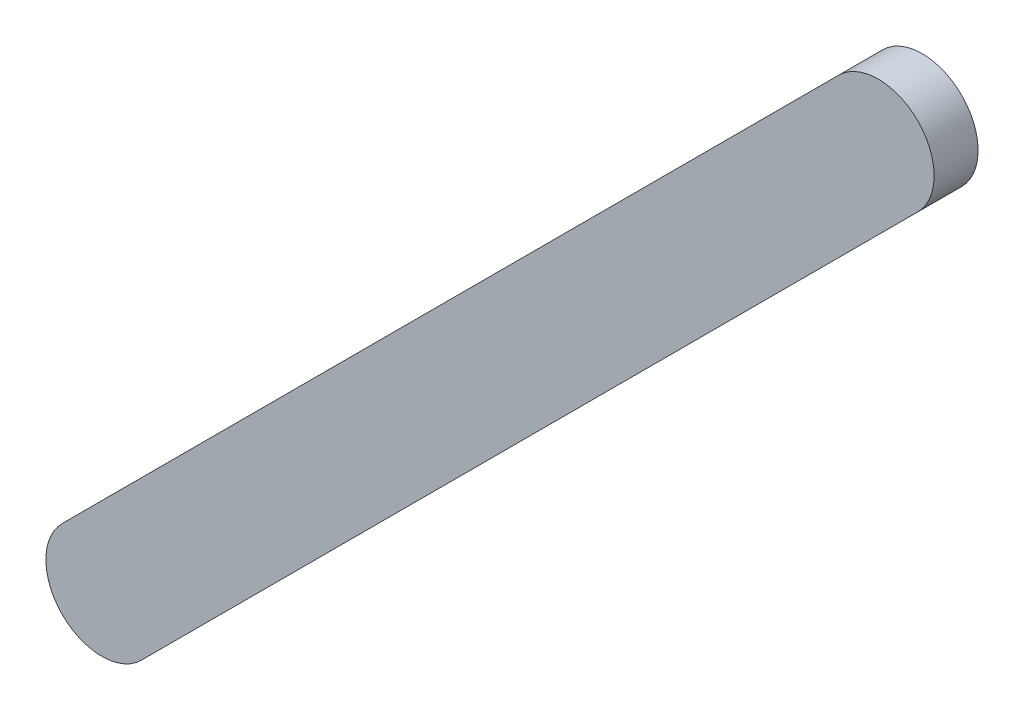
ISO-10303-21;
HEADER;
FILE_DESCRIPTION(('STEP AP214'),'2;1');
FILE_NAME('part.step','',(''),(''),'','','');
FILE_SCHEMA(('AUTOMOTIVE_DESIGN { 1 0 10303 214 1 1 1 1 }'));
ENDSEC;
DATA;
#1=APPLICATION_CONTEXT('core data for automotive mechanical design processes');
#2=APPLICATION_PROTOCOL_DEFINITION('international standard','automotive_design',2000,#1);
#3=PRODUCT_CONTEXT('',#1,'mechanical');
#4=PRODUCT('Part','Part','',(#3));
#5=PRODUCT_RELATED_PRODUCT_CATEGORY('part','',(#4));
#6=PRODUCT_DEFINITION_FORMATION('','',#4);
#7=PRODUCT_DEFINITION_CONTEXT('part definition',#1,'design');
#8=PRODUCT_DEFINITION('design','',#6,#7);
#9=PRODUCT_DEFINITION_SHAPE('','',#8);
#10=(LENGTH_UNIT() NAMED_UNIT(*) SI_UNIT(.MILLI.,.METRE.));
#11=(NAMED_UNIT(*) PLANE_ANGLE_UNIT() SI_UNIT($,.RADIAN.));
#12=(NAMED_UNIT(*) SI_UNIT($,.STERADIAN.) SOLID_ANGLE_UNIT());
#13=UNCERTAINTY_MEASURE_WITH_UNIT(LENGTH_MEASURE(1.E-05),#10,'distance_accuracy_value','');
#14=(GEOMETRIC_REPRESENTATION_CONTEXT(3) GLOBAL_UNCERTAINTY_ASSIGNED_CONTEXT((#13)) GLOBAL_UNIT_ASSIGNED_CONTEXT((#10,
#11,#12)) REPRESENTATION_CONTEXT('',''));
#15=CARTESIAN_POINT('',(0.,0.,0.));
#16=DIRECTION('',(0.,0.,1.));
#17=DIRECTION('',(1.,0.,0.));
#18=AXIS2_PLACEMENT_3D('',#15,#16,#17);
#19=CARTESIAN_POINT('',(113.71760594,52.2713966,0.));
#20=DIRECTION('',(-0.707106781186547,0.707106781186548,0.));
#21=DIRECTION('',(0.707106781186548,0.707106781186547,0.));
#22=AXIS2_PLACEMENT_3D('',#19,#20,#21);
#23=PLANE('',#22);
#24=DIRECTION('',(0.707106781186548,0.707106781186547,0.));
#25=VECTOR('',#24,1.);
#26=CARTESIAN_POINT('',(113.71760594,52.2713966,0.1999996));
#27=LINE('',#26,#25);
#28=CARTESIAN_POINT('',(113.71760594,52.2713966,0.1999996));
#29=VERTEX_POINT('',#28);
#30=CARTESIAN_POINT('',(117.2482034,55.80199406,0.1999996));
#31=VERTEX_POINT('',#30);
#32=EDGE_CURVE('E11',#29,#31,#27,.T.);
#33=ORIENTED_EDGE('',*,*,#32,.F.);
#34=DIRECTION('',(0.,0.,1.));
#35=VECTOR('',#34,1.);
#36=CARTESIAN_POINT('',(113.71760594,52.2713966,0.));
#37=LINE('',#36,#35);
#38=CARTESIAN_POINT('',(113.71760594,52.2713966,0.));
#39=VERTEX_POINT('',#38);
#40=EDGE_CURVE('E24',#39,#29,#37,.T.);
#41=ORIENTED_EDGE('',*,*,#40,.F.);
#42=DIRECTION('',(0.707106781186548,0.707106781186547,0.));
#43=VECTOR('',#42,1.);
#44=CARTESIAN_POINT('',(113.71760594,52.2713966,0.));
#45=LINE('',#44,#43);
#46=CARTESIAN_POINT('',(117.2482034,55.80199406,0.));
#47=VERTEX_POINT('',#46);
#48=EDGE_CURVE('E75',#39,#47,#45,.T.);
#49=ORIENTED_EDGE('',*,*,#48,.T.);
#50=DIRECTION('',(0.,0.,1.));
#51=VECTOR('',#50,1.);
#52=CARTESIAN_POINT('',(117.2482034,55.80199406,0.));
#53=LINE('',#52,#51);
#54=EDGE_CURVE('E37',#47,#31,#53,.T.);
#55=ORIENTED_EDGE('',*,*,#54,.T.);
#56=EDGE_LOOP('',(#33,#41,#49,#55));
#57=FACE_BOUND('',#56,.T.);
#58=ADVANCED_FACE('F17',(#57),#23,.F.);
#59=CARTESIAN_POINT('',(117.06859873,55.98159873,0.));
#60=DIRECTION('',(0.,0.,-1.));
#61=DIRECTION('',(0.707106781186548,-0.707106781186548,0.));
#62=AXIS2_PLACEMENT_3D('',#59,#60,#61);
#63=CYLINDRICAL_SURFACE('',#62,0.253999360179546);
#64=CARTESIAN_POINT('',(117.06859873,55.98159873,0.1999996));
#65=DIRECTION('',(0.,0.,1.));
#66=DIRECTION('',(0.707106781186548,-0.707106781186548,0.));
#67=AXIS2_PLACEMENT_3D('',#64,#65,#66);
#68=CIRCLE('',#67,0.253999360179546);
#69=CARTESIAN_POINT('',(116.88899406,56.1612034,0.1999996));
#70=VERTEX_POINT('',#69);
#71=EDGE_CURVE('E83',#31,#70,#68,.T.);
#72=ORIENTED_EDGE('',*,*,#71,.F.);
#73=ORIENTED_EDGE('',*,*,#54,.F.);
#74=CARTESIAN_POINT('',(117.06859873,55.98159873,0.));
#75=DIRECTION('',(0.,0.,1.));
#76=DIRECTION('',(0.707106781186548,-0.707106781186548,0.));
#77=AXIS2_PLACEMENT_3D('',#74,#75,#76);
#78=CIRCLE('',#77,0.253999360179546);
#79=CARTESIAN_POINT('',(116.88899406,56.1612034,0.));
#80=VERTEX_POINT('',#79);
#81=EDGE_CURVE('E81',#47,#80,#78,.T.);
#82=ORIENTED_EDGE('',*,*,#81,.T.);
#83=DIRECTION('',(0.,0.,1.));
#84=VECTOR('',#83,1.);
#85=CARTESIAN_POINT('',(116.88899406,56.1612034,0.));
#86=LINE('',#85,#84);
#87=EDGE_CURVE('E67',#80,#70,#86,.T.);
#88=ORIENTED_EDGE('',*,*,#87,.T.);
#89=EDGE_LOOP('',(#72,#73,#82,#88));
#90=FACE_BOUND('',#89,.T.);
#91=ADVANCED_FACE('F89',(#90),#63,.T.);
#92=CARTESIAN_POINT('',(116.88899406,56.1612034,0.));
#93=DIRECTION('',(0.707106781186549,-0.707106781186546,0.));
#94=DIRECTION('',(-0.707106781186546,-0.707106781186549,0.));
#95=AXIS2_PLACEMENT_3D('',#92,#93,#94);
#96=PLANE('',#95);
#97=DIRECTION('',(-0.707106781186546,-0.707106781186549,0.));
#98=VECTOR('',#97,1.);
#99=CARTESIAN_POINT('',(116.88899406,56.1612034,0.1999996));
#100=LINE('',#99,#98);
#101=CARTESIAN_POINT('',(113.3583966,52.63060594,0.1999996));
#102=VERTEX_POINT('',#101);
#103=EDGE_CURVE('E71',#70,#102,#100,.T.);
#104=ORIENTED_EDGE('',*,*,#103,.F.);
#105=ORIENTED_EDGE('',*,*,#87,.F.);
#106=DIRECTION('',(-0.707106781186546,-0.707106781186549,0.));
#107=VECTOR('',#106,1.);
#108=CARTESIAN_POINT('',(116.88899406,56.1612034,0.));
#109=LINE('',#108,#107);
#110=CARTESIAN_POINT('',(113.3583966,52.63060594,0.));
#111=VERTEX_POINT('',#110);
#112=EDGE_CURVE('E63',#80,#111,#109,.T.);
#113=ORIENTED_EDGE('',*,*,#112,.T.);
#114=DIRECTION('',(0.,0.,1.));
#115=VECTOR('',#114,1.);
#116=CARTESIAN_POINT('',(113.3583966,52.63060594,0.));
#117=LINE('',#116,#115);
#118=EDGE_CURVE('E53',#111,#102,#117,.T.);
#119=ORIENTED_EDGE('',*,*,#118,.T.);
#120=EDGE_LOOP('',(#104,#105,#113,#119));
#121=FACE_BOUND('',#120,.T.);
#122=ADVANCED_FACE('F66',(#121),#96,.F.);
#123=CARTESIAN_POINT('',(113.53800127,52.45100127,0.));
#124=DIRECTION('',(0.,0.,-1.));
#125=DIRECTION('',(-0.70710678118652,0.707106781186576,0.));
#126=AXIS2_PLACEMENT_3D('',#123,#124,#125);
#127=CYLINDRICAL_SURFACE('',#126,0.253999360179539);
#128=CARTESIAN_POINT('',(113.53800127,52.45100127,0.1999996));
#129=DIRECTION('',(0.,0.,1.));
#130=DIRECTION('',(-0.70710678118652,0.707106781186576,0.));
#131=AXIS2_PLACEMENT_3D('',#128,#129,#130);
#132=CIRCLE('',#131,0.253999360179539);
#133=EDGE_CURVE('E59',#102,#29,#132,.T.);
#134=ORIENTED_EDGE('',*,*,#133,.F.);
#135=ORIENTED_EDGE('',*,*,#118,.F.);
#136=CARTESIAN_POINT('',(113.53800127,52.45100127,0.));
#137=DIRECTION('',(0.,0.,1.));
#138=DIRECTION('',(-0.70710678118652,0.707106781186576,0.));
#139=AXIS2_PLACEMENT_3D('',#136,#137,#138);
#140=CIRCLE('',#139,0.253999360179539);
#141=EDGE_CURVE('E57',#111,#39,#140,.T.);
#142=ORIENTED_EDGE('',*,*,#141,.T.);
#143=ORIENTED_EDGE('',*,*,#40,.T.);
#144=EDGE_LOOP('',(#134,#135,#142,#143));
#145=FACE_BOUND('',#144,.T.);
#146=ADVANCED_FACE('F55',(#145),#127,.T.);
#147=CARTESIAN_POINT('',(113.71760594,52.2713966,0.));
#148=DIRECTION('',(0.,0.,-1.));
#149=DIRECTION('',(-1.,0.,0.));
#150=AXIS2_PLACEMENT_3D('',#147,#148,#149);
#151=PLANE('',#150);
#152=ORIENTED_EDGE('',*,*,#141,.F.);
#153=ORIENTED_EDGE('',*,*,#112,.F.);
#154=ORIENTED_EDGE('',*,*,#81,.F.);
#155=ORIENTED_EDGE('',*,*,#48,.F.);
#156=EDGE_LOOP('',(#152,#153,#154,#155));
#157=FACE_BOUND('',#156,.T.);
#158=ADVANCED_FACE('F74',(#157),#151,.T.);
#159=CARTESIAN_POINT('',(113.71760594,52.2713966,0.1999996));
#160=DIRECTION('',(0.,0.,-1.));
#161=DIRECTION('',(-1.,0.,0.));
#162=AXIS2_PLACEMENT_3D('',#159,#160,#161);
#163=PLANE('',#162);
#164=ORIENTED_EDGE('',*,*,#32,.T.);
#165=ORIENTED_EDGE('',*,*,#71,.T.);
#166=ORIENTED_EDGE('',*,*,#103,.T.);
#167=ORIENTED_EDGE('',*,*,#133,.T.);
#168=EDGE_LOOP('',(#164,#165,#166,#167));
#169=FACE_BOUND('',#168,.T.);
#170=ADVANCED_FACE('F91',(#169),#163,.F.);
#171=CLOSED_SHELL('',(#58,#91,#122,#146,#158,#170));
#172=MANIFOLD_SOLID_BREP('B1',#171);
#173=ADVANCED_BREP_SHAPE_REPRESENTATION('',(#18,#172),#14);
#174=SHAPE_DEFINITION_REPRESENTATION(#9,#173);
ENDSEC;
END-ISO-10303-21;
